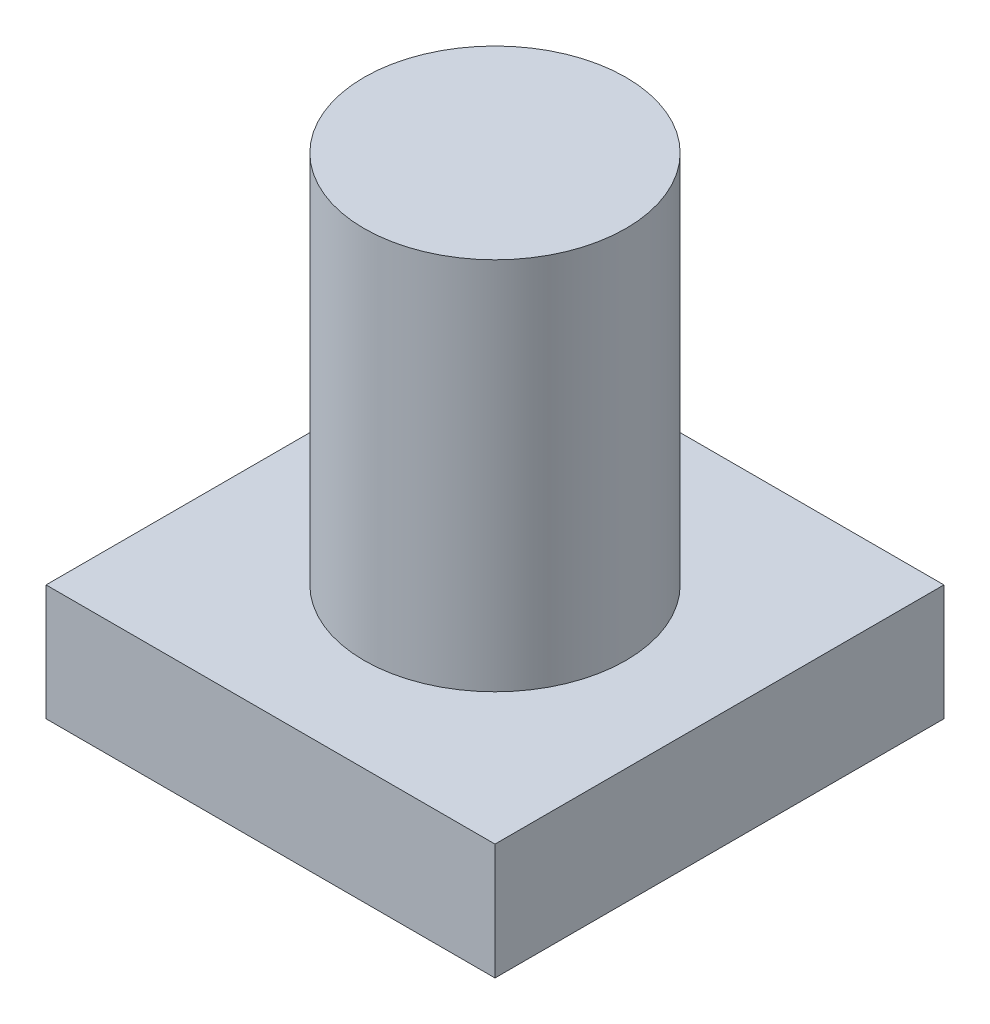
ISO-10303-21;
HEADER;
FILE_DESCRIPTION(('STEP AP214'),'2;1');
FILE_NAME('part.step','',(''),(''),'','','');
FILE_SCHEMA(('AUTOMOTIVE_DESIGN { 1 0 10303 214 1 1 1 1 }'));
ENDSEC;
DATA;
#1=APPLICATION_CONTEXT('core data for automotive mechanical design processes');
#2=APPLICATION_PROTOCOL_DEFINITION('international standard','automotive_design',2000,#1);
#3=PRODUCT_CONTEXT('',#1,'mechanical');
#4=PRODUCT('Part','Part','',(#3));
#5=PRODUCT_RELATED_PRODUCT_CATEGORY('part','',(#4));
#6=PRODUCT_DEFINITION_FORMATION('','',#4);
#7=PRODUCT_DEFINITION_CONTEXT('part definition',#1,'design');
#8=PRODUCT_DEFINITION('design','',#6,#7);
#9=PRODUCT_DEFINITION_SHAPE('','',#8);
#10=(LENGTH_UNIT() NAMED_UNIT(*) SI_UNIT(.MILLI.,.METRE.));
#11=(NAMED_UNIT(*) PLANE_ANGLE_UNIT() SI_UNIT($,.RADIAN.));
#12=(NAMED_UNIT(*) SI_UNIT($,.STERADIAN.) SOLID_ANGLE_UNIT());
#13=UNCERTAINTY_MEASURE_WITH_UNIT(LENGTH_MEASURE(1.E-05),#10,'distance_accuracy_value','');
#14=(GEOMETRIC_REPRESENTATION_CONTEXT(3) GLOBAL_UNCERTAINTY_ASSIGNED_CONTEXT((#13)) GLOBAL_UNIT_ASSIGNED_CONTEXT((#10,
#11,#12)) REPRESENTATION_CONTEXT('',''));
#15=CARTESIAN_POINT('',(0.,0.,0.));
#16=DIRECTION('',(0.,0.,1.));
#17=DIRECTION('',(1.,0.,0.));
#18=AXIS2_PLACEMENT_3D('',#15,#16,#17);
#19=CARTESIAN_POINT('',(-6.,3.1,-6.));
#20=DIRECTION('',(0.,1.,0.));
#21=DIRECTION('',(0.,0.,1.));
#22=AXIS2_PLACEMENT_3D('',#19,#20,#21);
#23=PLANE('',#22);
#24=DIRECTION('',(0.,0.,1.));
#25=VECTOR('',#24,1.);
#26=CARTESIAN_POINT('',(-6.,3.1,-6.));
#27=LINE('',#26,#25);
#28=CARTESIAN_POINT('',(-6.,3.1,-6.));
#29=VERTEX_POINT('',#28);
#30=CARTESIAN_POINT('',(-6.,3.1,6.));
#31=VERTEX_POINT('',#30);
#32=EDGE_CURVE('E103',#29,#31,#27,.T.);
#33=ORIENTED_EDGE('',*,*,#32,.T.);
#34=DIRECTION('',(1.,0.,0.));
#35=VECTOR('',#34,1.);
#36=CARTESIAN_POINT('',(-6.,3.1,6.));
#37=LINE('',#36,#35);
#38=CARTESIAN_POINT('',(6.00000000000003,3.1,6.));
#39=VERTEX_POINT('',#38);
#40=EDGE_CURVE('E88',#31,#39,#37,.T.);
#41=ORIENTED_EDGE('',*,*,#40,.T.);
#42=DIRECTION('',(0.,0.,-1.));
#43=VECTOR('',#42,1.);
#44=CARTESIAN_POINT('',(6.,3.1,-6.));
#45=LINE('',#44,#43);
#46=CARTESIAN_POINT('',(6.,3.1,-6.));
#47=VERTEX_POINT('',#46);
#48=EDGE_CURVE('E55',#39,#47,#45,.T.);
#49=ORIENTED_EDGE('',*,*,#48,.T.);
#50=DIRECTION('',(-1.,0.,0.));
#51=VECTOR('',#50,1.);
#52=CARTESIAN_POINT('',(-6.,3.1,-6.));
#53=LINE('',#52,#51);
#54=EDGE_CURVE('E50',#47,#29,#53,.T.);
#55=ORIENTED_EDGE('',*,*,#54,.T.);
#56=EDGE_LOOP('',(#33,#41,#49,#55));
#57=FACE_BOUND('',#56,.T.);
#58=CARTESIAN_POINT('',(0.,3.1,0.));
#59=DIRECTION('',(0.,1.,0.));
#60=DIRECTION('',(0.,0.,1.));
#61=AXIS2_PLACEMENT_3D('',#58,#59,#60);
#62=CIRCLE('',#61,3.5);
#63=CARTESIAN_POINT('',(0.,3.1,3.5));
#64=VERTEX_POINT('',#63);
#65=EDGE_CURVE('E96',#64,#64,#62,.T.);
#66=ORIENTED_EDGE('',*,*,#65,.F.);
#67=EDGE_LOOP('',(#66));
#68=FACE_BOUND('',#67,.T.);
#69=ADVANCED_FACE('F35',(#57,#68),#23,.T.);
#70=CARTESIAN_POINT('',(-6.,3.1,-6.));
#71=DIRECTION('',(1.,0.,0.));
#72=DIRECTION('',(0.,0.,-1.));
#73=AXIS2_PLACEMENT_3D('',#70,#71,#72);
#74=PLANE('',#73);
#75=DIRECTION('',(0.,0.,1.));
#76=VECTOR('',#75,1.);
#77=CARTESIAN_POINT('',(-6.,0.,-6.));
#78=LINE('',#77,#76);
#79=CARTESIAN_POINT('',(-6.,0.,-6.));
#80=VERTEX_POINT('',#79);
#81=CARTESIAN_POINT('',(-6.,0.,6.));
#82=VERTEX_POINT('',#81);
#83=EDGE_CURVE('E80',#80,#82,#78,.T.);
#84=ORIENTED_EDGE('',*,*,#83,.T.);
#85=DIRECTION('',(0.,-1.,0.));
#86=VECTOR('',#85,1.);
#87=CARTESIAN_POINT('',(-6.,3.1,6.));
#88=LINE('',#87,#86);
#89=EDGE_CURVE('E11',#31,#82,#88,.T.);
#90=ORIENTED_EDGE('',*,*,#89,.F.);
#91=ORIENTED_EDGE('',*,*,#32,.F.);
#92=DIRECTION('',(0.,-1.,0.));
#93=VECTOR('',#92,1.);
#94=CARTESIAN_POINT('',(-6.,3.1,-6.));
#95=LINE('',#94,#93);
#96=EDGE_CURVE('E92',#29,#80,#95,.T.);
#97=ORIENTED_EDGE('',*,*,#96,.T.);
#98=EDGE_LOOP('',(#84,#90,#91,#97));
#99=FACE_BOUND('',#98,.T.);
#100=ADVANCED_FACE('F37',(#99),#74,.F.);
#101=CARTESIAN_POINT('',(-6.,3.1,6.));
#102=DIRECTION('',(0.,0.,-1.));
#103=DIRECTION('',(-1.,0.,0.));
#104=AXIS2_PLACEMENT_3D('',#101,#102,#103);
#105=PLANE('',#104);
#106=DIRECTION('',(1.,0.,0.));
#107=VECTOR('',#106,1.);
#108=CARTESIAN_POINT('',(-6.,0.,6.));
#109=LINE('',#108,#107);
#110=CARTESIAN_POINT('',(6.00000000000003,0.,6.));
#111=VERTEX_POINT('',#110);
#112=EDGE_CURVE('E76',#82,#111,#109,.T.);
#113=ORIENTED_EDGE('',*,*,#112,.T.);
#114=DIRECTION('',(0.,-1.,0.));
#115=VECTOR('',#114,1.);
#116=CARTESIAN_POINT('',(6.00000000000003,3.1,6.));
#117=LINE('',#116,#115);
#118=EDGE_CURVE('E43',#39,#111,#117,.T.);
#119=ORIENTED_EDGE('',*,*,#118,.F.);
#120=ORIENTED_EDGE('',*,*,#40,.F.);
#121=ORIENTED_EDGE('',*,*,#89,.T.);
#122=EDGE_LOOP('',(#113,#119,#120,#121));
#123=FACE_BOUND('',#122,.T.);
#124=ADVANCED_FACE('F87',(#123),#105,.F.);
#125=CARTESIAN_POINT('',(6.,3.1,-6.));
#126=DIRECTION('',(-1.,0.,0.));
#127=DIRECTION('',(0.,0.,1.));
#128=AXIS2_PLACEMENT_3D('',#125,#126,#127);
#129=PLANE('',#128);
#130=DIRECTION('',(0.,0.,-1.));
#131=VECTOR('',#130,1.);
#132=CARTESIAN_POINT('',(6.,0.,-6.));
#133=LINE('',#132,#131);
#134=CARTESIAN_POINT('',(6.,0.,-6.));
#135=VERTEX_POINT('',#134);
#136=EDGE_CURVE('E81',#111,#135,#133,.T.);
#137=ORIENTED_EDGE('',*,*,#136,.T.);
#138=DIRECTION('',(0.,-1.,0.));
#139=VECTOR('',#138,1.);
#140=CARTESIAN_POINT('',(6.,3.1,-6.));
#141=LINE('',#140,#139);
#142=EDGE_CURVE('E109',#47,#135,#141,.T.);
#143=ORIENTED_EDGE('',*,*,#142,.F.);
#144=ORIENTED_EDGE('',*,*,#48,.F.);
#145=ORIENTED_EDGE('',*,*,#118,.T.);
#146=EDGE_LOOP('',(#137,#143,#144,#145));
#147=FACE_BOUND('',#146,.T.);
#148=ADVANCED_FACE('F112',(#147),#129,.F.);
#149=CARTESIAN_POINT('',(-6.,3.1,-6.));
#150=DIRECTION('',(0.,0.,1.));
#151=DIRECTION('',(1.,0.,0.));
#152=AXIS2_PLACEMENT_3D('',#149,#150,#151);
#153=PLANE('',#152);
#154=DIRECTION('',(-1.,0.,0.));
#155=VECTOR('',#154,1.);
#156=CARTESIAN_POINT('',(-6.,0.,-6.));
#157=LINE('',#156,#155);
#158=EDGE_CURVE('E101',#135,#80,#157,.T.);
#159=ORIENTED_EDGE('',*,*,#158,.T.);
#160=ORIENTED_EDGE('',*,*,#96,.F.);
#161=ORIENTED_EDGE('',*,*,#54,.F.);
#162=ORIENTED_EDGE('',*,*,#142,.T.);
#163=EDGE_LOOP('',(#159,#160,#161,#162));
#164=FACE_BOUND('',#163,.T.);
#165=ADVANCED_FACE('F114',(#164),#153,.F.);
#166=CARTESIAN_POINT('',(-6.,0.,-6.));
#167=DIRECTION('',(0.,1.,0.));
#168=DIRECTION('',(0.,0.,1.));
#169=AXIS2_PLACEMENT_3D('',#166,#167,#168);
#170=PLANE('',#169);
#171=ORIENTED_EDGE('',*,*,#83,.F.);
#172=ORIENTED_EDGE('',*,*,#158,.F.);
#173=ORIENTED_EDGE('',*,*,#136,.F.);
#174=ORIENTED_EDGE('',*,*,#112,.F.);
#175=EDGE_LOOP('',(#171,#172,#173,#174));
#176=FACE_BOUND('',#175,.T.);
#177=ADVANCED_FACE('F77',(#176),#170,.F.);
#178=CARTESIAN_POINT('',(0.,13.1,0.));
#179=DIRECTION('',(0.,-1.,0.));
#180=DIRECTION('',(0.,0.,-1.));
#181=AXIS2_PLACEMENT_3D('',#178,#179,#180);
#182=CYLINDRICAL_SURFACE('',#181,3.5);
#183=CARTESIAN_POINT('',(0.,13.1,0.));
#184=DIRECTION('',(0.,1.,0.));
#185=DIRECTION('',(0.,0.,1.));
#186=AXIS2_PLACEMENT_3D('',#183,#184,#185);
#187=CIRCLE('',#186,3.5);
#188=CARTESIAN_POINT('',(0.,13.1,3.5));
#189=VERTEX_POINT('',#188);
#190=EDGE_CURVE('E93',#189,#189,#187,.T.);
#191=ORIENTED_EDGE('',*,*,#190,.F.);
#192=EDGE_LOOP('',(#191));
#193=FACE_BOUND('',#192,.T.);
#194=ORIENTED_EDGE('',*,*,#65,.T.);
#195=EDGE_LOOP('',(#194));
#196=FACE_BOUND('',#195,.T.);
#197=ADVANCED_FACE('F121',(#193,#196),#182,.T.);
#198=CARTESIAN_POINT('',(0.,13.1,0.));
#199=DIRECTION('',(0.,1.,0.));
#200=DIRECTION('',(0.,0.,1.));
#201=AXIS2_PLACEMENT_3D('',#198,#199,#200);
#202=PLANE('',#201);
#203=ORIENTED_EDGE('',*,*,#190,.T.);
#204=EDGE_LOOP('',(#203));
#205=FACE_BOUND('',#204,.T.);
#206=ADVANCED_FACE('F123',(#205),#202,.T.);
#207=CLOSED_SHELL('',(#69,#100,#124,#148,#165,#177,#197,#206));
#208=MANIFOLD_SOLID_BREP('B2',#207);
#209=ADVANCED_BREP_SHAPE_REPRESENTATION('',(#18,#208),#14);
#210=SHAPE_DEFINITION_REPRESENTATION(#9,#209);
ENDSEC;
END-ISO-10303-21;
